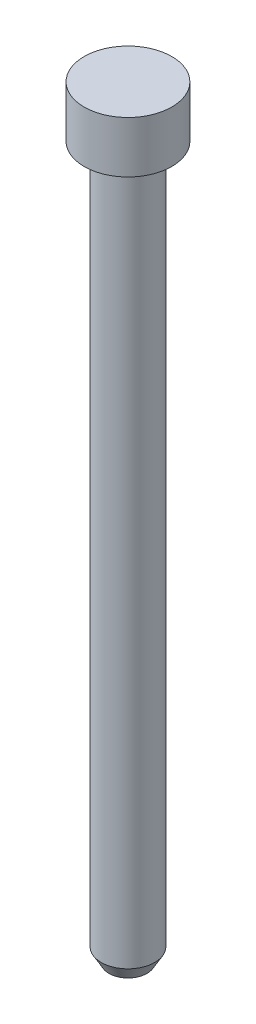
ISO-10303-21;
HEADER;
FILE_DESCRIPTION(('STEP AP214'),'2;1');
FILE_NAME('part.step','',(''),(''),'','','');
FILE_SCHEMA(('AUTOMOTIVE_DESIGN { 1 0 10303 214 1 1 1 1 }'));
ENDSEC;
DATA;
#1=APPLICATION_CONTEXT('core data for automotive mechanical design processes');
#2=APPLICATION_PROTOCOL_DEFINITION('international standard','automotive_design',2000,#1);
#3=PRODUCT_CONTEXT('',#1,'mechanical');
#4=PRODUCT('Part','Part','',(#3));
#5=PRODUCT_RELATED_PRODUCT_CATEGORY('part','',(#4));
#6=PRODUCT_DEFINITION_FORMATION('','',#4);
#7=PRODUCT_DEFINITION_CONTEXT('part definition',#1,'design');
#8=PRODUCT_DEFINITION('design','',#6,#7);
#9=PRODUCT_DEFINITION_SHAPE('','',#8);
#10=(LENGTH_UNIT() NAMED_UNIT(*) SI_UNIT(.MILLI.,.METRE.));
#11=(NAMED_UNIT(*) PLANE_ANGLE_UNIT() SI_UNIT($,.RADIAN.));
#12=(NAMED_UNIT(*) SI_UNIT($,.STERADIAN.) SOLID_ANGLE_UNIT());
#13=UNCERTAINTY_MEASURE_WITH_UNIT(LENGTH_MEASURE(1.E-05),#10,'distance_accuracy_value','');
#14=(GEOMETRIC_REPRESENTATION_CONTEXT(3) GLOBAL_UNCERTAINTY_ASSIGNED_CONTEXT((#13)) GLOBAL_UNIT_ASSIGNED_CONTEXT((#10,
#11,#12)) REPRESENTATION_CONTEXT('',''));
#15=CARTESIAN_POINT('',(0.,0.,0.));
#16=DIRECTION('',(0.,0.,1.));
#17=DIRECTION('',(1.,0.,0.));
#18=AXIS2_PLACEMENT_3D('',#15,#16,#17);
#19=CARTESIAN_POINT('',(0.,69.,0.));
#20=DIRECTION('',(0.,-1.,0.));
#21=DIRECTION('',(0.,0.,-1.));
#22=AXIS2_PLACEMENT_3D('',#19,#20,#21);
#23=CYLINDRICAL_SURFACE('',#22,2.6);
#24=CARTESIAN_POINT('',(0.,1.29903810567664,0.));
#25=DIRECTION('',(0.,1.,0.));
#26=DIRECTION('',(0.,0.,1.));
#27=AXIS2_PLACEMENT_3D('',#24,#25,#26);
#28=CIRCLE('',#27,2.6);
#29=CARTESIAN_POINT('',(0.,1.29903810567664,2.6));
#30=VERTEX_POINT('',#29);
#31=EDGE_CURVE('E47',#30,#30,#28,.T.);
#32=ORIENTED_EDGE('',*,*,#31,.T.);
#33=EDGE_LOOP('',(#32));
#34=FACE_BOUND('',#33,.T.);
#35=CARTESIAN_POINT('',(0.,68.5,0.));
#36=DIRECTION('',(0.,1.,0.));
#37=DIRECTION('',(0.,0.,1.));
#38=AXIS2_PLACEMENT_3D('',#35,#36,#37);
#39=CIRCLE('',#38,2.6);
#40=CARTESIAN_POINT('',(0.,68.5,2.6));
#41=VERTEX_POINT('',#40);
#42=EDGE_CURVE('E52',#41,#41,#39,.F.);
#43=ORIENTED_EDGE('',*,*,#42,.T.);
#44=EDGE_LOOP('',(#43));
#45=FACE_BOUND('',#44,.T.);
#46=ADVANCED_FACE('F38',(#34,#45),#23,.T.);
#47=CARTESIAN_POINT('',(0.,0.,0.));
#48=DIRECTION('',(0.,1.,0.));
#49=DIRECTION('',(0.,0.,1.));
#50=AXIS2_PLACEMENT_3D('',#47,#48,#49);
#51=PLANE('',#50);
#52=CARTESIAN_POINT('',(0.,0.,0.));
#53=DIRECTION('',(0.,1.,0.));
#54=DIRECTION('',(0.,0.,1.));
#55=AXIS2_PLACEMENT_3D('',#52,#53,#54);
#56=CIRCLE('',#55,1.85000000000001);
#57=CARTESIAN_POINT('',(0.,0.,1.85000000000001));
#58=VERTEX_POINT('',#57);
#59=EDGE_CURVE('E10',#58,#58,#56,.F.);
#60=ORIENTED_EDGE('',*,*,#59,.T.);
#61=EDGE_LOOP('',(#60));
#62=FACE_BOUND('',#61,.T.);
#63=ADVANCED_FACE('F77',(#62),#51,.F.);
#64=CARTESIAN_POINT('',(0.,74.,0.));
#65=DIRECTION('',(0.,-1.,0.));
#66=DIRECTION('',(0.,0.,-1.));
#67=AXIS2_PLACEMENT_3D('',#64,#65,#66);
#68=CYLINDRICAL_SURFACE('',#67,4.25);
#69=CARTESIAN_POINT('',(0.,74.,0.));
#70=DIRECTION('',(0.,1.,0.));
#71=DIRECTION('',(0.,0.,1.));
#72=AXIS2_PLACEMENT_3D('',#69,#70,#71);
#73=CIRCLE('',#72,4.25);
#74=CARTESIAN_POINT('',(0.,74.,4.25));
#75=VERTEX_POINT('',#74);
#76=EDGE_CURVE('E63',#75,#75,#73,.T.);
#77=ORIENTED_EDGE('',*,*,#76,.F.);
#78=EDGE_LOOP('',(#77));
#79=FACE_BOUND('',#78,.T.);
#80=CARTESIAN_POINT('',(0.,69.,0.));
#81=DIRECTION('',(0.,1.,0.));
#82=DIRECTION('',(0.,0.,1.));
#83=AXIS2_PLACEMENT_3D('',#80,#81,#82);
#84=CIRCLE('',#83,4.25);
#85=CARTESIAN_POINT('',(0.,69.,4.25));
#86=VERTEX_POINT('',#85);
#87=EDGE_CURVE('E64',#86,#86,#84,.T.);
#88=ORIENTED_EDGE('',*,*,#87,.T.);
#89=EDGE_LOOP('',(#88));
#90=FACE_BOUND('',#89,.T.);
#91=ADVANCED_FACE('F74',(#79,#90),#68,.T.);
#92=CARTESIAN_POINT('',(0.,74.,0.));
#93=DIRECTION('',(0.,1.,0.));
#94=DIRECTION('',(0.,0.,1.));
#95=AXIS2_PLACEMENT_3D('',#92,#93,#94);
#96=PLANE('',#95);
#97=ORIENTED_EDGE('',*,*,#76,.T.);
#98=EDGE_LOOP('',(#97));
#99=FACE_BOUND('',#98,.T.);
#100=ADVANCED_FACE('F72',(#99),#96,.T.);
#101=CARTESIAN_POINT('',(0.,69.,0.));
#102=DIRECTION('',(0.,1.,0.));
#103=DIRECTION('',(0.,0.,1.));
#104=AXIS2_PLACEMENT_3D('',#101,#102,#103);
#105=PLANE('',#104);
#106=CARTESIAN_POINT('',(0.,69.,0.));
#107=DIRECTION('',(0.,1.,0.));
#108=DIRECTION('',(0.,0.,1.));
#109=AXIS2_PLACEMENT_3D('',#106,#107,#108);
#110=CIRCLE('',#109,3.1);
#111=CARTESIAN_POINT('',(0.,69.,3.1));
#112=VERTEX_POINT('',#111);
#113=EDGE_CURVE('E57',#112,#112,#110,.T.);
#114=ORIENTED_EDGE('',*,*,#113,.T.);
#115=EDGE_LOOP('',(#114));
#116=FACE_BOUND('',#115,.T.);
#117=ORIENTED_EDGE('',*,*,#87,.F.);
#118=EDGE_LOOP('',(#117));
#119=FACE_BOUND('',#118,.T.);
#120=ADVANCED_FACE('F81',(#116,#119),#105,.F.);
#121=CARTESIAN_POINT('',(0.,68.5,0.));
#122=DIRECTION('',(0.,1.,0.));
#123=DIRECTION('',(0.,0.,1.));
#124=AXIS2_PLACEMENT_3D('',#121,#122,#123);
#125=TOROIDAL_SURFACE('',#124,3.1,0.5);
#126=ORIENTED_EDGE('',*,*,#42,.F.);
#127=EDGE_LOOP('',(#126));
#128=FACE_BOUND('',#127,.T.);
#129=ORIENTED_EDGE('',*,*,#113,.F.);
#130=EDGE_LOOP('',(#129));
#131=FACE_BOUND('',#130,.T.);
#132=ADVANCED_FACE('F83',(#128,#131),#125,.F.);
#133=CARTESIAN_POINT('',(0.,1.29903810567664,0.));
#134=DIRECTION('',(0.,1.,0.));
#135=DIRECTION('',(0.,0.,1.));
#136=AXIS2_PLACEMENT_3D('',#133,#134,#135);
#137=CONICAL_SURFACE('',#136,2.6,0.523598775598299);
#138=ORIENTED_EDGE('',*,*,#59,.F.);
#139=EDGE_LOOP('',(#138));
#140=FACE_BOUND('',#139,.T.);
#141=ORIENTED_EDGE('',*,*,#31,.F.);
#142=EDGE_LOOP('',(#141));
#143=FACE_BOUND('',#142,.T.);
#144=ADVANCED_FACE('F41',(#140,#143),#137,.T.);
#145=CLOSED_SHELL('',(#46,#63,#91,#100,#120,#132,#144));
#146=MANIFOLD_SOLID_BREP('B2',#145);
#147=ADVANCED_BREP_SHAPE_REPRESENTATION('',(#18,#146),#14);
#148=SHAPE_DEFINITION_REPRESENTATION(#9,#147);
ENDSEC;
END-ISO-10303-21;
